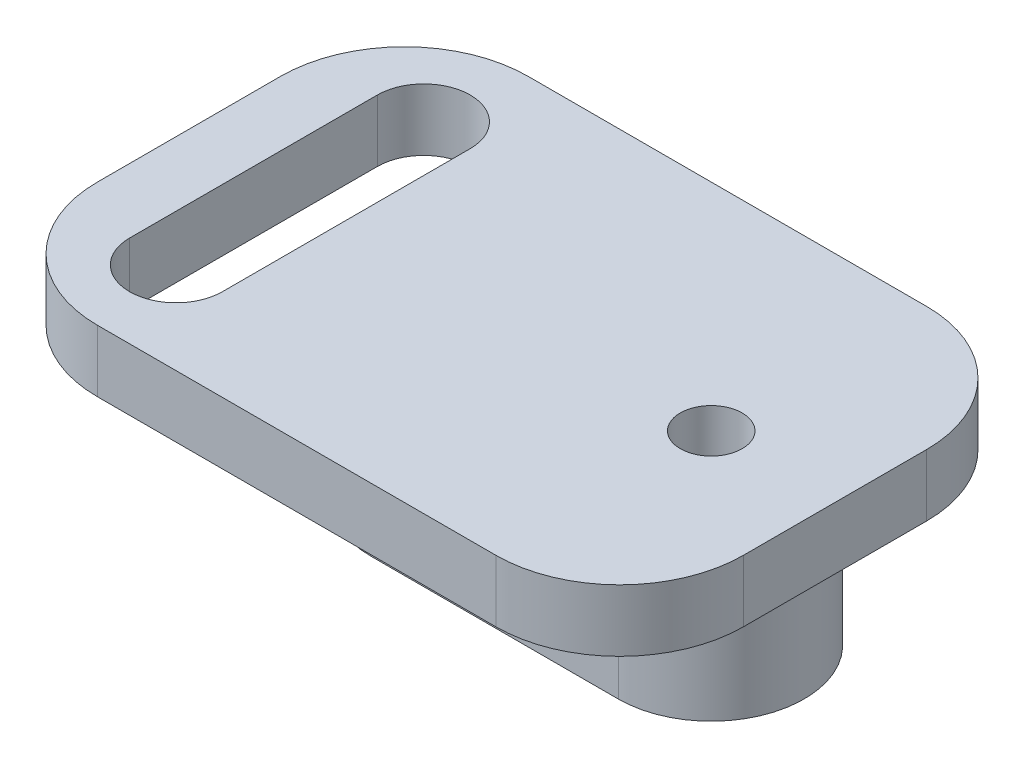
ISO-10303-21;
HEADER;
FILE_DESCRIPTION(('STEP AP214'),'2;1');
FILE_NAME('part.step','',(''),(''),'','','');
FILE_SCHEMA(('AUTOMOTIVE_DESIGN { 1 0 10303 214 1 1 1 1 }'));
ENDSEC;
DATA;
#1=APPLICATION_CONTEXT('core data for automotive mechanical design processes');
#2=APPLICATION_PROTOCOL_DEFINITION('international standard','automotive_design',2000,#1);
#3=PRODUCT_CONTEXT('',#1,'mechanical');
#4=PRODUCT('Part','Part','',(#3));
#5=PRODUCT_RELATED_PRODUCT_CATEGORY('part','',(#4));
#6=PRODUCT_DEFINITION_FORMATION('','',#4);
#7=PRODUCT_DEFINITION_CONTEXT('part definition',#1,'design');
#8=PRODUCT_DEFINITION('design','',#6,#7);
#9=PRODUCT_DEFINITION_SHAPE('','',#8);
#10=(LENGTH_UNIT() NAMED_UNIT(*) SI_UNIT(.MILLI.,.METRE.));
#11=(NAMED_UNIT(*) PLANE_ANGLE_UNIT() SI_UNIT($,.RADIAN.));
#12=(NAMED_UNIT(*) SI_UNIT($,.STERADIAN.) SOLID_ANGLE_UNIT());
#13=UNCERTAINTY_MEASURE_WITH_UNIT(LENGTH_MEASURE(1.E-05),#10,'distance_accuracy_value','');
#14=(GEOMETRIC_REPRESENTATION_CONTEXT(3) GLOBAL_UNCERTAINTY_ASSIGNED_CONTEXT((#13)) GLOBAL_UNIT_ASSIGNED_CONTEXT((#10,
#11,#12)) REPRESENTATION_CONTEXT('',''));
#15=CARTESIAN_POINT('',(0.,0.,0.));
#16=DIRECTION('',(0.,0.,1.));
#17=DIRECTION('',(1.,0.,0.));
#18=AXIS2_PLACEMENT_3D('',#15,#16,#17);
#19=CARTESIAN_POINT('',(10.,5.,-7.39105962744196));
#20=DIRECTION('',(0.,-1.,0.));
#21=DIRECTION('',(0.,0.,-1.));
#22=AXIS2_PLACEMENT_3D('',#19,#20,#21);
#23=CYLINDRICAL_SURFACE('',#22,10.);
#24=CARTESIAN_POINT('',(10.,0.,-7.39105962744196));
#25=DIRECTION('',(0.,1.,0.));
#26=DIRECTION('',(0.,0.,1.));
#27=AXIS2_PLACEMENT_3D('',#24,#25,#26);
#28=CIRCLE('',#27,10.);
#29=CARTESIAN_POINT('',(10.,0.,-17.391059627442));
#30=VERTEX_POINT('',#29);
#31=CARTESIAN_POINT('',(20.,0.,-7.39105962744196));
#32=VERTEX_POINT('',#31);
#33=EDGE_CURVE('E233',#30,#32,#28,.F.);
#34=ORIENTED_EDGE('',*,*,#33,.F.);
#35=DIRECTION('',(0.,-1.,0.));
#36=VECTOR('',#35,1.);
#37=CARTESIAN_POINT('',(10.,5.,-17.391059627442));
#38=LINE('',#37,#36);
#39=CARTESIAN_POINT('',(10.,5.,-17.391059627442));
#40=VERTEX_POINT('',#39);
#41=EDGE_CURVE('E11',#40,#30,#38,.T.);
#42=ORIENTED_EDGE('',*,*,#41,.F.);
#43=CARTESIAN_POINT('',(10.,5.,-7.39105962744196));
#44=DIRECTION('',(0.,1.,0.));
#45=DIRECTION('',(0.,0.,1.));
#46=AXIS2_PLACEMENT_3D('',#43,#44,#45);
#47=CIRCLE('',#46,10.);
#48=CARTESIAN_POINT('',(20.,5.,-7.39105962744196));
#49=VERTEX_POINT('',#48);
#50=EDGE_CURVE('E270',#40,#49,#47,.F.);
#51=ORIENTED_EDGE('',*,*,#50,.T.);
#52=DIRECTION('',(0.,-1.,0.));
#53=VECTOR('',#52,1.);
#54=CARTESIAN_POINT('',(20.,5.,-7.39105962744196));
#55=LINE('',#54,#53);
#56=EDGE_CURVE('E112',#49,#32,#55,.T.);
#57=ORIENTED_EDGE('',*,*,#56,.T.);
#58=EDGE_LOOP('',(#34,#42,#51,#57));
#59=FACE_BOUND('',#58,.T.);
#60=ADVANCED_FACE('F41',(#59),#23,.T.);
#61=CARTESIAN_POINT('',(0.,5.,-17.391059627442));
#62=DIRECTION('',(0.,0.,-1.));
#63=DIRECTION('',(-1.,0.,0.));
#64=AXIS2_PLACEMENT_3D('',#61,#62,#63);
#65=PLANE('',#64);
#66=DIRECTION('',(1.,0.,0.));
#67=VECTOR('',#66,1.);
#68=CARTESIAN_POINT('',(0.,0.,-17.391059627442));
#69=LINE('',#68,#67);
#70=CARTESIAN_POINT('',(-22.1615486260912,0.,-17.391059627442));
#71=VERTEX_POINT('',#70);
#72=EDGE_CURVE('E229',#71,#30,#69,.T.);
#73=ORIENTED_EDGE('',*,*,#72,.F.);
#74=DIRECTION('',(0.,-1.,0.));
#75=VECTOR('',#74,1.);
#76=CARTESIAN_POINT('',(-22.1615486260912,5.,-17.391059627442));
#77=LINE('',#76,#75);
#78=CARTESIAN_POINT('',(-22.1615486260912,5.,-17.391059627442));
#79=VERTEX_POINT('',#78);
#80=EDGE_CURVE('E51',#79,#71,#77,.T.);
#81=ORIENTED_EDGE('',*,*,#80,.F.);
#82=DIRECTION('',(1.,0.,0.));
#83=VECTOR('',#82,1.);
#84=CARTESIAN_POINT('',(0.,5.,-17.391059627442));
#85=LINE('',#84,#83);
#86=EDGE_CURVE('E266',#79,#40,#85,.T.);
#87=ORIENTED_EDGE('',*,*,#86,.T.);
#88=ORIENTED_EDGE('',*,*,#41,.T.);
#89=EDGE_LOOP('',(#73,#81,#87,#88));
#90=FACE_BOUND('',#89,.T.);
#91=ADVANCED_FACE('F380',(#90),#65,.T.);
#92=CARTESIAN_POINT('',(-22.1615486260913,5.,-7.39105962744196));
#93=DIRECTION('',(0.,-1.,0.));
#94=DIRECTION('',(0.,0.,-1.));
#95=AXIS2_PLACEMENT_3D('',#92,#93,#94);
#96=CYLINDRICAL_SURFACE('',#95,10.);
#97=CARTESIAN_POINT('',(-22.1615486260913,0.,-7.39105962744196));
#98=DIRECTION('',(0.,1.,0.));
#99=DIRECTION('',(0.,0.,1.));
#100=AXIS2_PLACEMENT_3D('',#97,#98,#99);
#101=CIRCLE('',#100,10.);
#102=CARTESIAN_POINT('',(-32.1615486260913,0.,-7.39105962744189));
#103=VERTEX_POINT('',#102);
#104=EDGE_CURVE('E225',#103,#71,#101,.F.);
#105=ORIENTED_EDGE('',*,*,#104,.F.);
#106=DIRECTION('',(0.,-1.,0.));
#107=VECTOR('',#106,1.);
#108=CARTESIAN_POINT('',(-32.1615486260913,5.,-7.39105962744189));
#109=LINE('',#108,#107);
#110=CARTESIAN_POINT('',(-32.1615486260913,5.,-7.39105962744189));
#111=VERTEX_POINT('',#110);
#112=EDGE_CURVE('E187',#111,#103,#109,.T.);
#113=ORIENTED_EDGE('',*,*,#112,.F.);
#114=CARTESIAN_POINT('',(-22.1615486260913,5.,-7.39105962744196));
#115=DIRECTION('',(0.,1.,0.));
#116=DIRECTION('',(0.,0.,1.));
#117=AXIS2_PLACEMENT_3D('',#114,#115,#116);
#118=CIRCLE('',#117,10.);
#119=EDGE_CURVE('E262',#111,#79,#118,.F.);
#120=ORIENTED_EDGE('',*,*,#119,.T.);
#121=ORIENTED_EDGE('',*,*,#80,.T.);
#122=EDGE_LOOP('',(#105,#113,#120,#121));
#123=FACE_BOUND('',#122,.T.);
#124=ADVANCED_FACE('F383',(#123),#96,.T.);
#125=CARTESIAN_POINT('',(-32.1615486260913,5.,0.));
#126=DIRECTION('',(-1.,0.,0.));
#127=DIRECTION('',(0.,0.,1.));
#128=AXIS2_PLACEMENT_3D('',#125,#126,#127);
#129=PLANE('',#128);
#130=DIRECTION('',(0.,0.,-1.));
#131=VECTOR('',#130,1.);
#132=CARTESIAN_POINT('',(-32.1615486260913,0.,0.));
#133=LINE('',#132,#131);
#134=CARTESIAN_POINT('',(-32.1615486260913,0.,7.39105962744189));
#135=VERTEX_POINT('',#134);
#136=EDGE_CURVE('E221',#135,#103,#133,.T.);
#137=ORIENTED_EDGE('',*,*,#136,.F.);
#138=DIRECTION('',(0.,-1.,0.));
#139=VECTOR('',#138,1.);
#140=CARTESIAN_POINT('',(-32.1615486260913,5.,7.39105962744189));
#141=LINE('',#140,#139);
#142=CARTESIAN_POINT('',(-32.1615486260913,5.,7.39105962744189));
#143=VERTEX_POINT('',#142);
#144=EDGE_CURVE('E180',#143,#135,#141,.T.);
#145=ORIENTED_EDGE('',*,*,#144,.F.);
#146=DIRECTION('',(0.,0.,-1.));
#147=VECTOR('',#146,1.);
#148=CARTESIAN_POINT('',(-32.1615486260913,5.,0.));
#149=LINE('',#148,#147);
#150=EDGE_CURVE('E258',#143,#111,#149,.T.);
#151=ORIENTED_EDGE('',*,*,#150,.T.);
#152=ORIENTED_EDGE('',*,*,#112,.T.);
#153=EDGE_LOOP('',(#137,#145,#151,#152));
#154=FACE_BOUND('',#153,.T.);
#155=ADVANCED_FACE('F386',(#154),#129,.T.);
#156=CARTESIAN_POINT('',(-22.1615486260913,5.,7.39105962744196));
#157=DIRECTION('',(0.,-1.,0.));
#158=DIRECTION('',(0.,0.,-1.));
#159=AXIS2_PLACEMENT_3D('',#156,#157,#158);
#160=CYLINDRICAL_SURFACE('',#159,10.);
#161=CARTESIAN_POINT('',(-22.1615486260913,0.,7.39105962744196));
#162=DIRECTION('',(0.,1.,0.));
#163=DIRECTION('',(0.,0.,1.));
#164=AXIS2_PLACEMENT_3D('',#161,#162,#163);
#165=CIRCLE('',#164,10.);
#166=CARTESIAN_POINT('',(-22.1615486260912,0.,17.391059627442));
#167=VERTEX_POINT('',#166);
#168=EDGE_CURVE('E217',#167,#135,#165,.F.);
#169=ORIENTED_EDGE('',*,*,#168,.F.);
#170=DIRECTION('',(0.,-1.,0.));
#171=VECTOR('',#170,1.);
#172=CARTESIAN_POINT('',(-22.1615486260912,5.,17.391059627442));
#173=LINE('',#172,#171);
#174=CARTESIAN_POINT('',(-22.1615486260912,5.,17.391059627442));
#175=VERTEX_POINT('',#174);
#176=EDGE_CURVE('E176',#175,#167,#173,.T.);
#177=ORIENTED_EDGE('',*,*,#176,.F.);
#178=CARTESIAN_POINT('',(-22.1615486260913,5.,7.39105962744196));
#179=DIRECTION('',(0.,1.,0.));
#180=DIRECTION('',(0.,0.,1.));
#181=AXIS2_PLACEMENT_3D('',#178,#179,#180);
#182=CIRCLE('',#181,10.);
#183=EDGE_CURVE('E168',#175,#143,#182,.F.);
#184=ORIENTED_EDGE('',*,*,#183,.T.);
#185=ORIENTED_EDGE('',*,*,#144,.T.);
#186=EDGE_LOOP('',(#169,#177,#184,#185));
#187=FACE_BOUND('',#186,.T.);
#188=ADVANCED_FACE('F389',(#187),#160,.T.);
#189=CARTESIAN_POINT('',(0.,5.,17.391059627442));
#190=DIRECTION('',(0.,0.,-1.));
#191=DIRECTION('',(-1.,0.,0.));
#192=AXIS2_PLACEMENT_3D('',#189,#190,#191);
#193=PLANE('',#192);
#194=DIRECTION('',(1.,0.,0.));
#195=VECTOR('',#194,1.);
#196=CARTESIAN_POINT('',(0.,0.,17.391059627442));
#197=LINE('',#196,#195);
#198=CARTESIAN_POINT('',(10.,0.,17.391059627442));
#199=VERTEX_POINT('',#198);
#200=EDGE_CURVE('E174',#167,#199,#197,.T.);
#201=ORIENTED_EDGE('',*,*,#200,.T.);
#202=DIRECTION('',(0.,-1.,0.));
#203=VECTOR('',#202,1.);
#204=CARTESIAN_POINT('',(10.,5.,17.391059627442));
#205=LINE('',#204,#203);
#206=CARTESIAN_POINT('',(10.,5.,17.391059627442));
#207=VERTEX_POINT('',#206);
#208=EDGE_CURVE('E156',#207,#199,#205,.T.);
#209=ORIENTED_EDGE('',*,*,#208,.F.);
#210=DIRECTION('',(1.,0.,0.));
#211=VECTOR('',#210,1.);
#212=CARTESIAN_POINT('',(0.,5.,17.391059627442));
#213=LINE('',#212,#211);
#214=EDGE_CURVE('E161',#175,#207,#213,.T.);
#215=ORIENTED_EDGE('',*,*,#214,.F.);
#216=ORIENTED_EDGE('',*,*,#176,.T.);
#217=EDGE_LOOP('',(#201,#209,#215,#216));
#218=FACE_BOUND('',#217,.T.);
#219=ADVANCED_FACE('F172',(#218),#193,.F.);
#220=CARTESIAN_POINT('',(10.,5.,7.39105962744196));
#221=DIRECTION('',(0.,-1.,0.));
#222=DIRECTION('',(0.,0.,-1.));
#223=AXIS2_PLACEMENT_3D('',#220,#221,#222);
#224=CYLINDRICAL_SURFACE('',#223,10.);
#225=CARTESIAN_POINT('',(10.,0.,7.39105962744196));
#226=DIRECTION('',(0.,1.,0.));
#227=DIRECTION('',(0.,0.,1.));
#228=AXIS2_PLACEMENT_3D('',#225,#226,#227);
#229=CIRCLE('',#228,10.);
#230=CARTESIAN_POINT('',(20.,0.,7.39105962744196));
#231=VERTEX_POINT('',#230);
#232=EDGE_CURVE('E212',#199,#231,#229,.T.);
#233=ORIENTED_EDGE('',*,*,#232,.T.);
#234=DIRECTION('',(0.,-1.,0.));
#235=VECTOR('',#234,1.);
#236=CARTESIAN_POINT('',(20.,5.,7.39105962744196));
#237=LINE('',#236,#235);
#238=CARTESIAN_POINT('',(20.,5.,7.39105962744196));
#239=VERTEX_POINT('',#238);
#240=EDGE_CURVE('E159',#239,#231,#237,.T.);
#241=ORIENTED_EDGE('',*,*,#240,.F.);
#242=CARTESIAN_POINT('',(10.,5.,7.39105962744196));
#243=DIRECTION('',(0.,1.,0.));
#244=DIRECTION('',(0.,0.,1.));
#245=AXIS2_PLACEMENT_3D('',#242,#243,#244);
#246=CIRCLE('',#245,10.);
#247=EDGE_CURVE('E151',#207,#239,#246,.T.);
#248=ORIENTED_EDGE('',*,*,#247,.F.);
#249=ORIENTED_EDGE('',*,*,#208,.T.);
#250=EDGE_LOOP('',(#233,#241,#248,#249));
#251=FACE_BOUND('',#250,.T.);
#252=ADVANCED_FACE('F154',(#251),#224,.T.);
#253=CARTESIAN_POINT('',(-23.2015714955432,5.,10.));
#254=DIRECTION('',(0.,-1.,0.));
#255=DIRECTION('',(0.,0.,-1.));
#256=AXIS2_PLACEMENT_3D('',#253,#254,#255);
#257=CYLINDRICAL_SURFACE('',#256,3.75);
#258=CARTESIAN_POINT('',(-23.2015714955432,0.,10.));
#259=DIRECTION('',(0.,1.,0.));
#260=DIRECTION('',(0.,0.,1.));
#261=AXIS2_PLACEMENT_3D('',#258,#259,#260);
#262=CIRCLE('',#261,3.75);
#263=CARTESIAN_POINT('',(-26.9515714955432,0.,10.));
#264=VERTEX_POINT('',#263);
#265=CARTESIAN_POINT('',(-19.4515714955432,0.,10.));
#266=VERTEX_POINT('',#265);
#267=EDGE_CURVE('E249',#264,#266,#262,.T.);
#268=ORIENTED_EDGE('',*,*,#267,.F.);
#269=DIRECTION('',(0.,-1.,0.));
#270=VECTOR('',#269,1.);
#271=CARTESIAN_POINT('',(-26.9515714955432,5.,10.));
#272=LINE('',#271,#270);
#273=CARTESIAN_POINT('',(-26.9515714955432,5.,10.));
#274=VERTEX_POINT('',#273);
#275=EDGE_CURVE('E45',#274,#264,#272,.T.);
#276=ORIENTED_EDGE('',*,*,#275,.F.);
#277=CARTESIAN_POINT('',(-23.2015714955432,5.,10.));
#278=DIRECTION('',(0.,1.,0.));
#279=DIRECTION('',(0.,0.,1.));
#280=AXIS2_PLACEMENT_3D('',#277,#278,#279);
#281=CIRCLE('',#280,3.75);
#282=CARTESIAN_POINT('',(-19.4515714955432,5.,10.));
#283=VERTEX_POINT('',#282);
#284=EDGE_CURVE('E211',#274,#283,#281,.T.);
#285=ORIENTED_EDGE('',*,*,#284,.T.);
#286=DIRECTION('',(0.,-1.,0.));
#287=VECTOR('',#286,1.);
#288=CARTESIAN_POINT('',(-19.4515714955432,5.,10.));
#289=LINE('',#288,#287);
#290=EDGE_CURVE('E192',#283,#266,#289,.T.);
#291=ORIENTED_EDGE('',*,*,#290,.T.);
#292=EDGE_LOOP('',(#268,#276,#285,#291));
#293=FACE_BOUND('',#292,.T.);
#294=ADVANCED_FACE('F43',(#293),#257,.F.);
#295=CARTESIAN_POINT('',(-26.9515714955432,5.,0.));
#296=DIRECTION('',(1.,0.,0.));
#297=DIRECTION('',(0.,0.,-1.));
#298=AXIS2_PLACEMENT_3D('',#295,#296,#297);
#299=PLANE('',#298);
#300=DIRECTION('',(0.,0.,1.));
#301=VECTOR('',#300,1.);
#302=CARTESIAN_POINT('',(-26.9515714955432,0.,0.));
#303=LINE('',#302,#301);
#304=CARTESIAN_POINT('',(-26.9515714955432,0.,-10.));
#305=VERTEX_POINT('',#304);
#306=EDGE_CURVE('E245',#305,#264,#303,.T.);
#307=ORIENTED_EDGE('',*,*,#306,.F.);
#308=DIRECTION('',(0.,-1.,0.));
#309=VECTOR('',#308,1.);
#310=CARTESIAN_POINT('',(-26.9515714955432,5.,-10.));
#311=LINE('',#310,#309);
#312=CARTESIAN_POINT('',(-26.9515714955432,5.,-10.));
#313=VERTEX_POINT('',#312);
#314=EDGE_CURVE('E197',#313,#305,#311,.T.);
#315=ORIENTED_EDGE('',*,*,#314,.F.);
#316=DIRECTION('',(0.,0.,1.));
#317=VECTOR('',#316,1.);
#318=CARTESIAN_POINT('',(-26.9515714955432,5.,0.));
#319=LINE('',#318,#317);
#320=EDGE_CURVE('E279',#313,#274,#319,.T.);
#321=ORIENTED_EDGE('',*,*,#320,.T.);
#322=ORIENTED_EDGE('',*,*,#275,.T.);
#323=EDGE_LOOP('',(#307,#315,#321,#322));
#324=FACE_BOUND('',#323,.T.);
#325=ADVANCED_FACE('F413',(#324),#299,.T.);
#326=CARTESIAN_POINT('',(-23.2015714955432,5.,-10.));
#327=DIRECTION('',(0.,-1.,0.));
#328=DIRECTION('',(0.,0.,-1.));
#329=AXIS2_PLACEMENT_3D('',#326,#327,#328);
#330=CYLINDRICAL_SURFACE('',#329,3.75);
#331=CARTESIAN_POINT('',(-23.2015714955432,0.,-10.));
#332=DIRECTION('',(0.,1.,0.));
#333=DIRECTION('',(0.,0.,1.));
#334=AXIS2_PLACEMENT_3D('',#331,#332,#333);
#335=CIRCLE('',#334,3.75);
#336=CARTESIAN_POINT('',(-19.4515714955432,0.,-10.));
#337=VERTEX_POINT('',#336);
#338=EDGE_CURVE('E241',#337,#305,#335,.T.);
#339=ORIENTED_EDGE('',*,*,#338,.F.);
#340=DIRECTION('',(0.,-1.,0.));
#341=VECTOR('',#340,1.);
#342=CARTESIAN_POINT('',(-19.4515714955432,5.,-10.));
#343=LINE('',#342,#341);
#344=CARTESIAN_POINT('',(-19.4515714955432,5.,-10.));
#345=VERTEX_POINT('',#344);
#346=EDGE_CURVE('E195',#345,#337,#343,.T.);
#347=ORIENTED_EDGE('',*,*,#346,.F.);
#348=CARTESIAN_POINT('',(-23.2015714955432,5.,-10.));
#349=DIRECTION('',(0.,1.,0.));
#350=DIRECTION('',(0.,0.,1.));
#351=AXIS2_PLACEMENT_3D('',#348,#349,#350);
#352=CIRCLE('',#351,3.75);
#353=EDGE_CURVE('E276',#345,#313,#352,.T.);
#354=ORIENTED_EDGE('',*,*,#353,.T.);
#355=ORIENTED_EDGE('',*,*,#314,.T.);
#356=EDGE_LOOP('',(#339,#347,#354,#355));
#357=FACE_BOUND('',#356,.T.);
#358=ADVANCED_FACE('F410',(#357),#330,.F.);
#359=CARTESIAN_POINT('',(-19.4515714955432,5.,0.));
#360=DIRECTION('',(1.,0.,0.));
#361=DIRECTION('',(0.,0.,-1.));
#362=AXIS2_PLACEMENT_3D('',#359,#360,#361);
#363=PLANE('',#362);
#364=DIRECTION('',(0.,0.,1.));
#365=VECTOR('',#364,1.);
#366=CARTESIAN_POINT('',(-19.4515714955432,0.,0.));
#367=LINE('',#366,#365);
#368=EDGE_CURVE('E237',#337,#266,#367,.T.);
#369=ORIENTED_EDGE('',*,*,#368,.T.);
#370=ORIENTED_EDGE('',*,*,#290,.F.);
#371=DIRECTION('',(0.,0.,1.));
#372=VECTOR('',#371,1.);
#373=CARTESIAN_POINT('',(-19.4515714955432,5.,0.));
#374=LINE('',#373,#372);
#375=EDGE_CURVE('E273',#345,#283,#374,.T.);
#376=ORIENTED_EDGE('',*,*,#375,.F.);
#377=ORIENTED_EDGE('',*,*,#346,.T.);
#378=EDGE_LOOP('',(#369,#370,#376,#377));
#379=FACE_BOUND('',#378,.T.);
#380=ADVANCED_FACE('F406',(#379),#363,.F.);
#381=CARTESIAN_POINT('',(20.,5.,0.));
#382=DIRECTION('',(-1.,0.,0.));
#383=DIRECTION('',(0.,0.,1.));
#384=AXIS2_PLACEMENT_3D('',#381,#382,#383);
#385=PLANE('',#384);
#386=DIRECTION('',(0.,0.,-1.));
#387=VECTOR('',#386,1.);
#388=CARTESIAN_POINT('',(20.,0.,0.));
#389=LINE('',#388,#387);
#390=EDGE_CURVE('E208',#231,#32,#389,.T.);
#391=ORIENTED_EDGE('',*,*,#390,.T.);
#392=ORIENTED_EDGE('',*,*,#56,.F.);
#393=DIRECTION('',(0.,0.,-1.));
#394=VECTOR('',#393,1.);
#395=CARTESIAN_POINT('',(20.,5.,0.));
#396=LINE('',#395,#394);
#397=EDGE_CURVE('E68',#239,#49,#396,.T.);
#398=ORIENTED_EDGE('',*,*,#397,.F.);
#399=ORIENTED_EDGE('',*,*,#240,.T.);
#400=EDGE_LOOP('',(#391,#392,#398,#399));
#401=FACE_BOUND('',#400,.T.);
#402=ADVANCED_FACE('F409',(#401),#385,.F.);
#403=CARTESIAN_POINT('',(0.,5.,0.));
#404=DIRECTION('',(0.,1.,0.));
#405=DIRECTION('',(0.,0.,1.));
#406=AXIS2_PLACEMENT_3D('',#403,#404,#405);
#407=PLANE('',#406);
#408=CARTESIAN_POINT('',(10.,5.,0.));
#409=DIRECTION('',(0.,1.,0.));
#410=DIRECTION('',(0.,0.,1.));
#411=AXIS2_PLACEMENT_3D('',#408,#409,#410);
#412=CIRCLE('',#411,2.5);
#413=CARTESIAN_POINT('',(10.,5.,2.5));
#414=VERTEX_POINT('',#413);
#415=EDGE_CURVE('E313',#414,#414,#412,.T.);
#416=ORIENTED_EDGE('',*,*,#415,.F.);
#417=EDGE_LOOP('',(#416));
#418=FACE_BOUND('',#417,.T.);
#419=ORIENTED_EDGE('',*,*,#284,.F.);
#420=ORIENTED_EDGE('',*,*,#320,.F.);
#421=ORIENTED_EDGE('',*,*,#353,.F.);
#422=ORIENTED_EDGE('',*,*,#375,.T.);
#423=EDGE_LOOP('',(#419,#420,#421,#422));
#424=FACE_BOUND('',#423,.T.);
#425=ORIENTED_EDGE('',*,*,#50,.F.);
#426=ORIENTED_EDGE('',*,*,#86,.F.);
#427=ORIENTED_EDGE('',*,*,#119,.F.);
#428=ORIENTED_EDGE('',*,*,#150,.F.);
#429=ORIENTED_EDGE('',*,*,#183,.F.);
#430=ORIENTED_EDGE('',*,*,#214,.T.);
#431=ORIENTED_EDGE('',*,*,#247,.T.);
#432=ORIENTED_EDGE('',*,*,#397,.T.);
#433=EDGE_LOOP('',(#425,#426,#427,#428,#429,#430,#431,#432));
#434=FACE_BOUND('',#433,.T.);
#435=ADVANCED_FACE('F165',(#418,#424,#434),#407,.T.);
#436=CARTESIAN_POINT('',(0.,0.,0.));
#437=DIRECTION('',(0.,1.,0.));
#438=DIRECTION('',(0.,0.,1.));
#439=AXIS2_PLACEMENT_3D('',#436,#437,#438);
#440=PLANE('',#439);
#441=CARTESIAN_POINT('',(-10.,0.,0.));
#442=DIRECTION('',(0.,1.,0.));
#443=DIRECTION('',(0.,0.,1.));
#444=AXIS2_PLACEMENT_3D('',#441,#442,#443);
#445=CIRCLE('',#444,7.5);
#446=CARTESIAN_POINT('',(-10.,0.,-7.5));
#447=VERTEX_POINT('',#446);
#448=CARTESIAN_POINT('',(-10.,0.,7.5));
#449=VERTEX_POINT('',#448);
#450=EDGE_CURVE('E298',#447,#449,#445,.T.);
#451=ORIENTED_EDGE('',*,*,#450,.T.);
#452=DIRECTION('',(1.,0.,0.));
#453=VECTOR('',#452,1.);
#454=CARTESIAN_POINT('',(0.,0.,7.5));
#455=LINE('',#454,#453);
#456=CARTESIAN_POINT('',(10.,0.,7.5));
#457=VERTEX_POINT('',#456);
#458=EDGE_CURVE('E309',#449,#457,#455,.T.);
#459=ORIENTED_EDGE('',*,*,#458,.T.);
#460=CARTESIAN_POINT('',(10.,0.,0.));
#461=DIRECTION('',(0.,1.,0.));
#462=DIRECTION('',(0.,0.,1.));
#463=AXIS2_PLACEMENT_3D('',#460,#461,#462);
#464=CIRCLE('',#463,7.5);
#465=CARTESIAN_POINT('',(10.,0.,-7.5));
#466=VERTEX_POINT('',#465);
#467=EDGE_CURVE('E305',#457,#466,#464,.T.);
#468=ORIENTED_EDGE('',*,*,#467,.T.);
#469=DIRECTION('',(1.,0.,0.));
#470=VECTOR('',#469,1.);
#471=CARTESIAN_POINT('',(0.,0.,-7.5));
#472=LINE('',#471,#470);
#473=EDGE_CURVE('E59',#447,#466,#472,.T.);
#474=ORIENTED_EDGE('',*,*,#473,.F.);
#475=EDGE_LOOP('',(#451,#459,#468,#474));
#476=FACE_BOUND('',#475,.T.);
#477=ORIENTED_EDGE('',*,*,#267,.T.);
#478=ORIENTED_EDGE('',*,*,#368,.F.);
#479=ORIENTED_EDGE('',*,*,#338,.T.);
#480=ORIENTED_EDGE('',*,*,#306,.T.);
#481=EDGE_LOOP('',(#477,#478,#479,#480));
#482=FACE_BOUND('',#481,.T.);
#483=ORIENTED_EDGE('',*,*,#33,.T.);
#484=ORIENTED_EDGE('',*,*,#390,.F.);
#485=ORIENTED_EDGE('',*,*,#232,.F.);
#486=ORIENTED_EDGE('',*,*,#200,.F.);
#487=ORIENTED_EDGE('',*,*,#168,.T.);
#488=ORIENTED_EDGE('',*,*,#136,.T.);
#489=ORIENTED_EDGE('',*,*,#104,.T.);
#490=ORIENTED_EDGE('',*,*,#72,.T.);
#491=EDGE_LOOP('',(#483,#484,#485,#486,#487,#488,#489,#490));
#492=FACE_BOUND('',#491,.T.);
#493=ADVANCED_FACE('F370',(#476,#482,#492),#440,.F.);
#494=CARTESIAN_POINT('',(0.,-10.,7.5));
#495=DIRECTION('',(0.,0.,1.));
#496=DIRECTION('',(1.,0.,0.));
#497=AXIS2_PLACEMENT_3D('',#494,#495,#496);
#498=PLANE('',#497);
#499=ORIENTED_EDGE('',*,*,#458,.F.);
#500=DIRECTION('',(0.,1.,0.));
#501=VECTOR('',#500,1.);
#502=CARTESIAN_POINT('',(-10.,-10.,7.5));
#503=LINE('',#502,#501);
#504=CARTESIAN_POINT('',(-10.,-10.,7.5));
#505=VERTEX_POINT('',#504);
#506=EDGE_CURVE('E253',#505,#449,#503,.T.);
#507=ORIENTED_EDGE('',*,*,#506,.F.);
#508=DIRECTION('',(1.,0.,0.));
#509=VECTOR('',#508,1.);
#510=CARTESIAN_POINT('',(0.,-10.,7.5));
#511=LINE('',#510,#509);
#512=CARTESIAN_POINT('',(10.,-10.,7.5));
#513=VERTEX_POINT('',#512);
#514=EDGE_CURVE('E302',#505,#513,#511,.T.);
#515=ORIENTED_EDGE('',*,*,#514,.T.);
#516=DIRECTION('',(0.,1.,0.));
#517=VECTOR('',#516,1.);
#518=CARTESIAN_POINT('',(10.,-10.,7.5));
#519=LINE('',#518,#517);
#520=EDGE_CURVE('E284',#513,#457,#519,.T.);
#521=ORIENTED_EDGE('',*,*,#520,.T.);
#522=EDGE_LOOP('',(#499,#507,#515,#521));
#523=FACE_BOUND('',#522,.T.);
#524=ADVANCED_FACE('F367',(#523),#498,.T.);
#525=CARTESIAN_POINT('',(-10.,-10.,0.));
#526=DIRECTION('',(0.,1.,0.));
#527=DIRECTION('',(0.,0.,1.));
#528=AXIS2_PLACEMENT_3D('',#525,#526,#527);
#529=CYLINDRICAL_SURFACE('',#528,7.5);
#530=ORIENTED_EDGE('',*,*,#450,.F.);
#531=DIRECTION('',(0.,1.,0.));
#532=VECTOR('',#531,1.);
#533=CARTESIAN_POINT('',(-10.,-10.,-7.5));
#534=LINE('',#533,#532);
#535=CARTESIAN_POINT('',(-10.,-10.,-7.5));
#536=VERTEX_POINT('',#535);
#537=EDGE_CURVE('E292',#536,#447,#534,.T.);
#538=ORIENTED_EDGE('',*,*,#537,.F.);
#539=CARTESIAN_POINT('',(-10.,-10.,0.));
#540=DIRECTION('',(0.,1.,0.));
#541=DIRECTION('',(0.,0.,1.));
#542=AXIS2_PLACEMENT_3D('',#539,#540,#541);
#543=CIRCLE('',#542,7.5);
#544=EDGE_CURVE('E289',#536,#505,#543,.T.);
#545=ORIENTED_EDGE('',*,*,#544,.T.);
#546=ORIENTED_EDGE('',*,*,#506,.T.);
#547=EDGE_LOOP('',(#530,#538,#545,#546));
#548=FACE_BOUND('',#547,.T.);
#549=ADVANCED_FACE('F354',(#548),#529,.T.);
#550=CARTESIAN_POINT('',(0.,-10.,-7.5));
#551=DIRECTION('',(0.,0.,1.));
#552=DIRECTION('',(1.,0.,0.));
#553=AXIS2_PLACEMENT_3D('',#550,#551,#552);
#554=PLANE('',#553);
#555=ORIENTED_EDGE('',*,*,#473,.T.);
#556=DIRECTION('',(0.,1.,0.));
#557=VECTOR('',#556,1.);
#558=CARTESIAN_POINT('',(10.,-10.,-7.5));
#559=LINE('',#558,#557);
#560=CARTESIAN_POINT('',(10.,-10.,-7.5));
#561=VERTEX_POINT('',#560);
#562=EDGE_CURVE('E288',#561,#466,#559,.T.);
#563=ORIENTED_EDGE('',*,*,#562,.F.);
#564=DIRECTION('',(1.,0.,0.));
#565=VECTOR('',#564,1.);
#566=CARTESIAN_POINT('',(0.,-10.,-7.5));
#567=LINE('',#566,#565);
#568=EDGE_CURVE('E317',#536,#561,#567,.T.);
#569=ORIENTED_EDGE('',*,*,#568,.F.);
#570=ORIENTED_EDGE('',*,*,#537,.T.);
#571=EDGE_LOOP('',(#555,#563,#569,#570));
#572=FACE_BOUND('',#571,.T.);
#573=ADVANCED_FACE('F360',(#572),#554,.F.);
#574=CARTESIAN_POINT('',(10.,-10.,0.));
#575=DIRECTION('',(0.,1.,0.));
#576=DIRECTION('',(0.,0.,1.));
#577=AXIS2_PLACEMENT_3D('',#574,#575,#576);
#578=CYLINDRICAL_SURFACE('',#577,7.5);
#579=ORIENTED_EDGE('',*,*,#467,.F.);
#580=ORIENTED_EDGE('',*,*,#520,.F.);
#581=CARTESIAN_POINT('',(10.,-10.,0.));
#582=DIRECTION('',(0.,1.,0.));
#583=DIRECTION('',(0.,0.,1.));
#584=AXIS2_PLACEMENT_3D('',#581,#582,#583);
#585=CIRCLE('',#584,7.5);
#586=EDGE_CURVE('E321',#513,#561,#585,.T.);
#587=ORIENTED_EDGE('',*,*,#586,.T.);
#588=ORIENTED_EDGE('',*,*,#562,.T.);
#589=EDGE_LOOP('',(#579,#580,#587,#588));
#590=FACE_BOUND('',#589,.T.);
#591=ADVANCED_FACE('F341',(#590),#578,.T.);
#592=CARTESIAN_POINT('',(0.,-10.,0.));
#593=DIRECTION('',(0.,1.,0.));
#594=DIRECTION('',(0.,0.,1.));
#595=AXIS2_PLACEMENT_3D('',#592,#593,#594);
#596=PLANE('',#595);
#597=CARTESIAN_POINT('',(10.,-10.,0.));
#598=DIRECTION('',(0.,-1.,0.));
#599=DIRECTION('',(0.,0.,-1.));
#600=AXIS2_PLACEMENT_3D('',#597,#598,#599);
#601=CIRCLE('',#600,2.5);
#602=CARTESIAN_POINT('',(10.,-10.,-2.5));
#603=VERTEX_POINT('',#602);
#604=EDGE_CURVE('E331',#603,#603,#601,.T.);
#605=ORIENTED_EDGE('',*,*,#604,.F.);
#606=EDGE_LOOP('',(#605));
#607=FACE_BOUND('',#606,.T.);
#608=ORIENTED_EDGE('',*,*,#514,.F.);
#609=ORIENTED_EDGE('',*,*,#544,.F.);
#610=ORIENTED_EDGE('',*,*,#568,.T.);
#611=ORIENTED_EDGE('',*,*,#586,.F.);
#612=EDGE_LOOP('',(#608,#609,#610,#611));
#613=FACE_BOUND('',#612,.T.);
#614=ADVANCED_FACE('F338',(#607,#613),#596,.F.);
#615=CARTESIAN_POINT('',(10.,6.,0.));
#616=DIRECTION('',(0.,-1.,0.));
#617=DIRECTION('',(0.,0.,-1.));
#618=AXIS2_PLACEMENT_3D('',#615,#616,#617);
#619=CYLINDRICAL_SURFACE('',#618,2.5);
#620=ORIENTED_EDGE('',*,*,#415,.T.);
#621=EDGE_LOOP('',(#620));
#622=FACE_BOUND('',#621,.T.);
#623=ORIENTED_EDGE('',*,*,#604,.T.);
#624=EDGE_LOOP('',(#623));
#625=FACE_BOUND('',#624,.T.);
#626=ADVANCED_FACE('F336',(#622,#625),#619,.F.);
#627=CLOSED_SHELL('',(#60,#91,#124,#155,#188,#219,#252,#294,#325,#358,#380,#402,#435,#493,#524,
#549,#573,#591,#614,#626));
#628=MANIFOLD_SOLID_BREP('B2',#627);
#629=ADVANCED_BREP_SHAPE_REPRESENTATION('',(#18,#628),#14);
#630=SHAPE_DEFINITION_REPRESENTATION(#9,#629);
ENDSEC;
END-ISO-10303-21;
